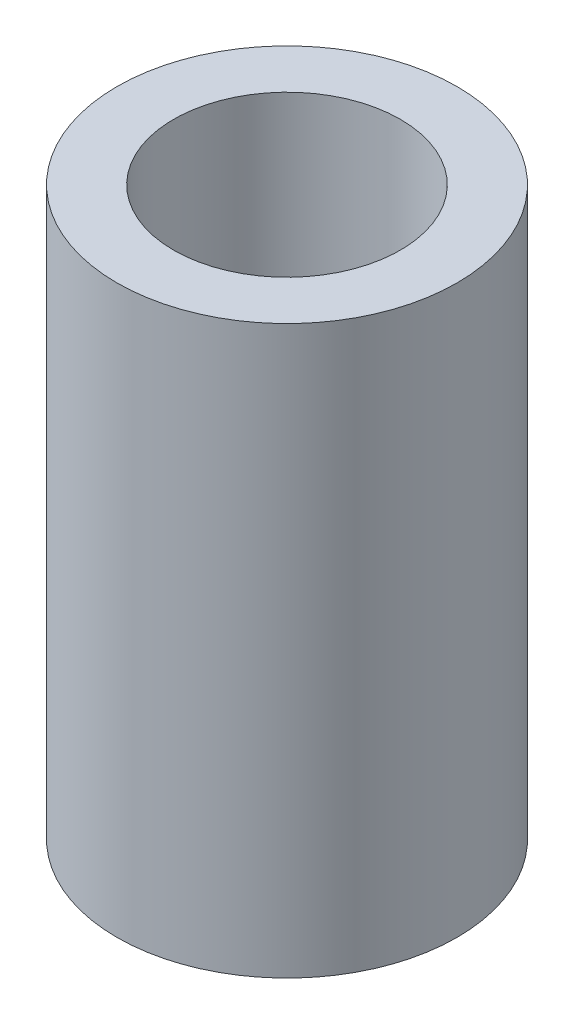
ISO-10303-21;
HEADER;
FILE_DESCRIPTION(('STEP AP214'),'2;1');
FILE_NAME('part.step','',(''),(''),'','','');
FILE_SCHEMA(('AUTOMOTIVE_DESIGN { 1 0 10303 214 1 1 1 1 }'));
ENDSEC;
DATA;
#1=APPLICATION_CONTEXT('core data for automotive mechanical design processes');
#2=APPLICATION_PROTOCOL_DEFINITION('international standard','automotive_design',2000,#1);
#3=PRODUCT_CONTEXT('',#1,'mechanical');
#4=PRODUCT('Part','Part','',(#3));
#5=PRODUCT_RELATED_PRODUCT_CATEGORY('part','',(#4));
#6=PRODUCT_DEFINITION_FORMATION('','',#4);
#7=PRODUCT_DEFINITION_CONTEXT('part definition',#1,'design');
#8=PRODUCT_DEFINITION('design','',#6,#7);
#9=PRODUCT_DEFINITION_SHAPE('','',#8);
#10=(LENGTH_UNIT() NAMED_UNIT(*) SI_UNIT(.MILLI.,.METRE.));
#11=(NAMED_UNIT(*) PLANE_ANGLE_UNIT() SI_UNIT($,.RADIAN.));
#12=(NAMED_UNIT(*) SI_UNIT($,.STERADIAN.) SOLID_ANGLE_UNIT());
#13=UNCERTAINTY_MEASURE_WITH_UNIT(LENGTH_MEASURE(1.E-05),#10,'distance_accuracy_value','');
#14=(GEOMETRIC_REPRESENTATION_CONTEXT(3) GLOBAL_UNCERTAINTY_ASSIGNED_CONTEXT((#13)) GLOBAL_UNIT_ASSIGNED_CONTEXT((#10,
#11,#12)) REPRESENTATION_CONTEXT('',''));
#15=CARTESIAN_POINT('',(0.,0.,0.));
#16=DIRECTION('',(0.,0.,1.));
#17=DIRECTION('',(1.,0.,0.));
#18=AXIS2_PLACEMENT_3D('',#15,#16,#17);
#19=CARTESIAN_POINT('',(0.,10.,0.));
#20=DIRECTION('',(0.,1.,0.));
#21=DIRECTION('',(0.,0.,1.));
#22=AXIS2_PLACEMENT_3D('',#19,#20,#21);
#23=PLANE('',#22);
#24=CARTESIAN_POINT('',(0.,10.,0.));
#25=DIRECTION('',(0.,1.,0.));
#26=DIRECTION('',(0.,0.,1.));
#27=AXIS2_PLACEMENT_3D('',#24,#25,#26);
#28=CIRCLE('',#27,3.);
#29=CARTESIAN_POINT('',(0.,10.,3.));
#30=VERTEX_POINT('',#29);
#31=EDGE_CURVE('E10',#30,#30,#28,.T.);
#32=ORIENTED_EDGE('',*,*,#31,.T.);
#33=EDGE_LOOP('',(#32));
#34=FACE_BOUND('',#33,.T.);
#35=CARTESIAN_POINT('',(0.,10.,0.));
#36=DIRECTION('',(0.,1.,0.));
#37=DIRECTION('',(0.,0.,1.));
#38=AXIS2_PLACEMENT_3D('',#35,#36,#37);
#39=CIRCLE('',#38,2.);
#40=CARTESIAN_POINT('',(0.,10.,2.));
#41=VERTEX_POINT('',#40);
#42=EDGE_CURVE('E56',#41,#41,#39,.T.);
#43=ORIENTED_EDGE('',*,*,#42,.F.);
#44=EDGE_LOOP('',(#43));
#45=FACE_BOUND('',#44,.T.);
#46=ADVANCED_FACE('F43',(#34,#45),#23,.T.);
#47=CARTESIAN_POINT('',(0.,0.,0.));
#48=DIRECTION('',(0.,1.,0.));
#49=DIRECTION('',(0.,0.,1.));
#50=AXIS2_PLACEMENT_3D('',#47,#48,#49);
#51=PLANE('',#50);
#52=CARTESIAN_POINT('',(0.,0.,0.));
#53=DIRECTION('',(0.,1.,0.));
#54=DIRECTION('',(0.,0.,1.));
#55=AXIS2_PLACEMENT_3D('',#52,#53,#54);
#56=CIRCLE('',#55,3.);
#57=CARTESIAN_POINT('',(0.,0.,3.));
#58=VERTEX_POINT('',#57);
#59=EDGE_CURVE('E47',#58,#58,#56,.T.);
#60=ORIENTED_EDGE('',*,*,#59,.F.);
#61=EDGE_LOOP('',(#60));
#62=FACE_BOUND('',#61,.T.);
#63=CARTESIAN_POINT('',(0.,0.,0.));
#64=DIRECTION('',(0.,1.,0.));
#65=DIRECTION('',(0.,0.,1.));
#66=AXIS2_PLACEMENT_3D('',#63,#64,#65);
#67=CIRCLE('',#66,2.);
#68=CARTESIAN_POINT('',(0.,0.,2.));
#69=VERTEX_POINT('',#68);
#70=EDGE_CURVE('E58',#69,#69,#67,.T.);
#71=ORIENTED_EDGE('',*,*,#70,.T.);
#72=EDGE_LOOP('',(#71));
#73=FACE_BOUND('',#72,.T.);
#74=ADVANCED_FACE('F70',(#62,#73),#51,.F.);
#75=CARTESIAN_POINT('',(0.,10.,0.));
#76=DIRECTION('',(0.,-1.,0.));
#77=DIRECTION('',(0.,0.,-1.));
#78=AXIS2_PLACEMENT_3D('',#75,#76,#77);
#79=CYLINDRICAL_SURFACE('',#78,3.);
#80=ORIENTED_EDGE('',*,*,#31,.F.);
#81=EDGE_LOOP('',(#80));
#82=FACE_BOUND('',#81,.T.);
#83=ORIENTED_EDGE('',*,*,#59,.T.);
#84=EDGE_LOOP('',(#83));
#85=FACE_BOUND('',#84,.T.);
#86=ADVANCED_FACE('F45',(#82,#85),#79,.T.);
#87=CARTESIAN_POINT('',(0.,10.,0.));
#88=DIRECTION('',(0.,-1.,0.));
#89=DIRECTION('',(0.,0.,-1.));
#90=AXIS2_PLACEMENT_3D('',#87,#88,#89);
#91=CYLINDRICAL_SURFACE('',#90,2.);
#92=ORIENTED_EDGE('',*,*,#42,.T.);
#93=EDGE_LOOP('',(#92));
#94=FACE_BOUND('',#93,.T.);
#95=ORIENTED_EDGE('',*,*,#70,.F.);
#96=EDGE_LOOP('',(#95));
#97=FACE_BOUND('',#96,.T.);
#98=ADVANCED_FACE('F66',(#94,#97),#91,.F.);
#99=CLOSED_SHELL('',(#46,#74,#86,#98));
#100=MANIFOLD_SOLID_BREP('B2',#99);
#101=ADVANCED_BREP_SHAPE_REPRESENTATION('',(#18,#100),#14);
#102=SHAPE_DEFINITION_REPRESENTATION(#9,#101);
ENDSEC;
END-ISO-10303-21;
